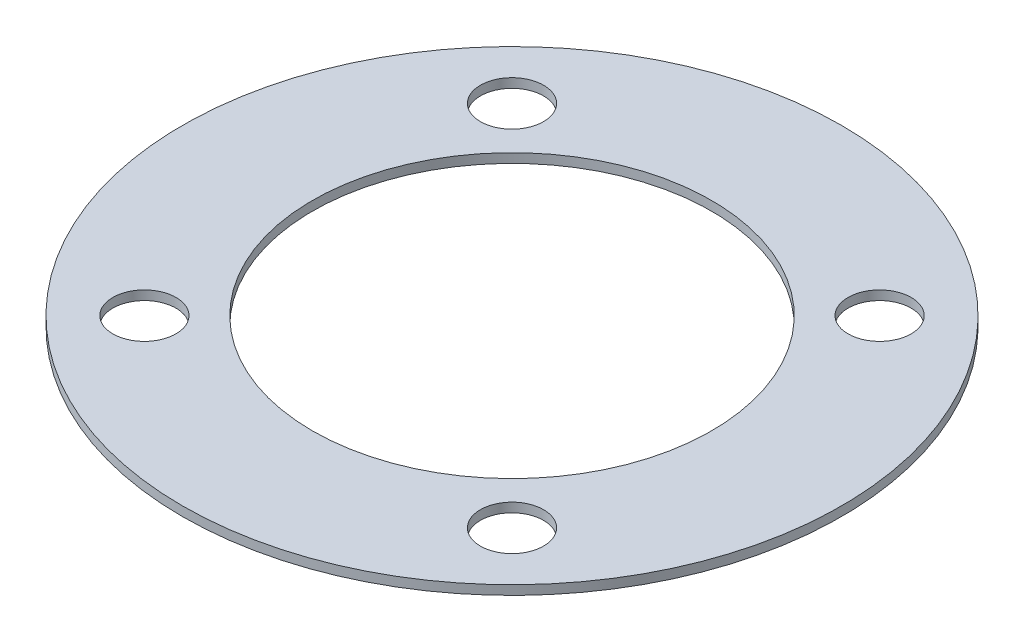
ISO-10303-21;
HEADER;
FILE_DESCRIPTION(('STEP AP214'),'2;1');
FILE_NAME('part.step','',(''),(''),'','','');
FILE_SCHEMA(('AUTOMOTIVE_DESIGN { 1 0 10303 214 1 1 1 1 }'));
ENDSEC;
DATA;
#1=APPLICATION_CONTEXT('core data for automotive mechanical design processes');
#2=APPLICATION_PROTOCOL_DEFINITION('international standard','automotive_design',2000,#1);
#3=PRODUCT_CONTEXT('',#1,'mechanical');
#4=PRODUCT('Part','Part','',(#3));
#5=PRODUCT_RELATED_PRODUCT_CATEGORY('part','',(#4));
#6=PRODUCT_DEFINITION_FORMATION('','',#4);
#7=PRODUCT_DEFINITION_CONTEXT('part definition',#1,'design');
#8=PRODUCT_DEFINITION('design','',#6,#7);
#9=PRODUCT_DEFINITION_SHAPE('','',#8);
#10=(LENGTH_UNIT() NAMED_UNIT(*) SI_UNIT(.MILLI.,.METRE.));
#11=(NAMED_UNIT(*) PLANE_ANGLE_UNIT() SI_UNIT($,.RADIAN.));
#12=(NAMED_UNIT(*) SI_UNIT($,.STERADIAN.) SOLID_ANGLE_UNIT());
#13=UNCERTAINTY_MEASURE_WITH_UNIT(LENGTH_MEASURE(1.E-05),#10,'distance_accuracy_value','');
#14=(GEOMETRIC_REPRESENTATION_CONTEXT(3) GLOBAL_UNCERTAINTY_ASSIGNED_CONTEXT((#13)) GLOBAL_UNIT_ASSIGNED_CONTEXT((#10,
#11,#12)) REPRESENTATION_CONTEXT('',''));
#15=CARTESIAN_POINT('',(0.,0.,0.));
#16=DIRECTION('',(0.,0.,1.));
#17=DIRECTION('',(1.,0.,0.));
#18=AXIS2_PLACEMENT_3D('',#15,#16,#17);
#19=CARTESIAN_POINT('',(0.,0.5,0.));
#20=DIRECTION('',(0.,-1.,0.));
#21=DIRECTION('',(0.,0.,-1.));
#22=AXIS2_PLACEMENT_3D('',#19,#20,#21);
#23=CYLINDRICAL_SURFACE('',#22,17.75);
#24=CARTESIAN_POINT('',(0.,0.5,0.));
#25=DIRECTION('',(0.,1.,0.));
#26=DIRECTION('',(0.,0.,1.));
#27=AXIS2_PLACEMENT_3D('',#24,#25,#26);
#28=CIRCLE('',#27,17.75);
#29=CARTESIAN_POINT('',(0.,0.5,17.75));
#30=VERTEX_POINT('',#29);
#31=EDGE_CURVE('E10',#30,#30,#28,.T.);
#32=ORIENTED_EDGE('',*,*,#31,.F.);
#33=EDGE_LOOP('',(#32));
#34=FACE_BOUND('',#33,.T.);
#35=CARTESIAN_POINT('',(0.,0.,0.));
#36=DIRECTION('',(0.,1.,0.));
#37=DIRECTION('',(0.,0.,1.));
#38=AXIS2_PLACEMENT_3D('',#35,#36,#37);
#39=CIRCLE('',#38,17.75);
#40=CARTESIAN_POINT('',(0.,0.,17.75));
#41=VERTEX_POINT('',#40);
#42=EDGE_CURVE('E41',#41,#41,#39,.T.);
#43=ORIENTED_EDGE('',*,*,#42,.T.);
#44=EDGE_LOOP('',(#43));
#45=FACE_BOUND('',#44,.T.);
#46=ADVANCED_FACE('F38',(#34,#45),#23,.T.);
#47=CARTESIAN_POINT('',(0.,0.5,0.));
#48=DIRECTION('',(0.,1.,0.));
#49=DIRECTION('',(0.,0.,1.));
#50=AXIS2_PLACEMENT_3D('',#47,#48,#49);
#51=PLANE('',#50);
#52=CARTESIAN_POINT('',(-9.89949493661167,0.5,-9.89949493661167));
#53=DIRECTION('',(0.,1.,0.));
#54=DIRECTION('',(0.,0.,1.));
#55=AXIS2_PLACEMENT_3D('',#52,#53,#54);
#56=CIRCLE('',#55,1.7);
#57=CARTESIAN_POINT('',(-9.89949493661167,0.5,-8.19949493661167));
#58=VERTEX_POINT('',#57);
#59=EDGE_CURVE('E76',#58,#58,#56,.T.);
#60=ORIENTED_EDGE('',*,*,#59,.F.);
#61=EDGE_LOOP('',(#60));
#62=FACE_BOUND('',#61,.T.);
#63=CARTESIAN_POINT('',(9.89949493661167,0.5,9.89949493661167));
#64=DIRECTION('',(0.,1.,0.));
#65=DIRECTION('',(0.,0.,1.));
#66=AXIS2_PLACEMENT_3D('',#63,#64,#65);
#67=CIRCLE('',#66,1.7);
#68=CARTESIAN_POINT('',(9.89949493661167,0.5,11.5994949366117));
#69=VERTEX_POINT('',#68);
#70=EDGE_CURVE('E70',#69,#69,#67,.T.);
#71=ORIENTED_EDGE('',*,*,#70,.F.);
#72=EDGE_LOOP('',(#71));
#73=FACE_BOUND('',#72,.T.);
#74=CARTESIAN_POINT('',(-9.89949493661167,0.5,9.89949493661167));
#75=DIRECTION('',(0.,1.,0.));
#76=DIRECTION('',(0.,0.,1.));
#77=AXIS2_PLACEMENT_3D('',#74,#75,#76);
#78=CIRCLE('',#77,1.7);
#79=CARTESIAN_POINT('',(-9.89949493661167,0.5,11.5994949366117));
#80=VERTEX_POINT('',#79);
#81=EDGE_CURVE('E64',#80,#80,#78,.T.);
#82=ORIENTED_EDGE('',*,*,#81,.F.);
#83=EDGE_LOOP('',(#82));
#84=FACE_BOUND('',#83,.T.);
#85=CARTESIAN_POINT('',(9.89949493661167,0.5,-9.89949493661167));
#86=DIRECTION('',(0.,1.,0.));
#87=DIRECTION('',(0.,0.,1.));
#88=AXIS2_PLACEMENT_3D('',#85,#86,#87);
#89=CIRCLE('',#88,1.7);
#90=CARTESIAN_POINT('',(9.89949493661167,0.5,-8.19949493661167));
#91=VERTEX_POINT('',#90);
#92=EDGE_CURVE('E58',#91,#91,#89,.T.);
#93=ORIENTED_EDGE('',*,*,#92,.F.);
#94=EDGE_LOOP('',(#93));
#95=FACE_BOUND('',#94,.T.);
#96=CARTESIAN_POINT('',(0.,0.5,0.));
#97=DIRECTION('',(0.,1.,0.));
#98=DIRECTION('',(0.,0.,1.));
#99=AXIS2_PLACEMENT_3D('',#96,#97,#98);
#100=CIRCLE('',#99,10.75);
#101=CARTESIAN_POINT('',(0.,0.5,10.75));
#102=VERTEX_POINT('',#101);
#103=EDGE_CURVE('E50',#102,#102,#100,.T.);
#104=ORIENTED_EDGE('',*,*,#103,.F.);
#105=EDGE_LOOP('',(#104));
#106=FACE_BOUND('',#105,.T.);
#107=ORIENTED_EDGE('',*,*,#31,.T.);
#108=EDGE_LOOP('',(#107));
#109=FACE_BOUND('',#108,.T.);
#110=ADVANCED_FACE('F82',(#62,#73,#84,#95,#106,#109),#51,.T.);
#111=CARTESIAN_POINT('',(0.,0.,0.));
#112=DIRECTION('',(0.,1.,0.));
#113=DIRECTION('',(0.,0.,1.));
#114=AXIS2_PLACEMENT_3D('',#111,#112,#113);
#115=PLANE('',#114);
#116=CARTESIAN_POINT('',(-9.89949493661167,0.,-9.89949493661167));
#117=DIRECTION('',(0.,1.,0.));
#118=DIRECTION('',(0.,0.,1.));
#119=AXIS2_PLACEMENT_3D('',#116,#117,#118);
#120=CIRCLE('',#119,1.7);
#121=CARTESIAN_POINT('',(-9.89949493661167,0.,-8.19949493661166));
#122=VERTEX_POINT('',#121);
#123=EDGE_CURVE('E73',#122,#122,#120,.T.);
#124=ORIENTED_EDGE('',*,*,#123,.T.);
#125=EDGE_LOOP('',(#124));
#126=FACE_BOUND('',#125,.T.);
#127=CARTESIAN_POINT('',(9.89949493661167,0.,9.89949493661167));
#128=DIRECTION('',(0.,1.,0.));
#129=DIRECTION('',(0.,0.,1.));
#130=AXIS2_PLACEMENT_3D('',#127,#128,#129);
#131=CIRCLE('',#130,1.7);
#132=CARTESIAN_POINT('',(9.89949493661167,0.,11.5994949366117));
#133=VERTEX_POINT('',#132);
#134=EDGE_CURVE('E67',#133,#133,#131,.T.);
#135=ORIENTED_EDGE('',*,*,#134,.T.);
#136=EDGE_LOOP('',(#135));
#137=FACE_BOUND('',#136,.T.);
#138=CARTESIAN_POINT('',(-9.89949493661167,0.,9.89949493661167));
#139=DIRECTION('',(0.,1.,0.));
#140=DIRECTION('',(0.,0.,1.));
#141=AXIS2_PLACEMENT_3D('',#138,#139,#140);
#142=CIRCLE('',#141,1.7);
#143=CARTESIAN_POINT('',(-9.89949493661167,0.,11.5994949366117));
#144=VERTEX_POINT('',#143);
#145=EDGE_CURVE('E61',#144,#144,#142,.T.);
#146=ORIENTED_EDGE('',*,*,#145,.T.);
#147=EDGE_LOOP('',(#146));
#148=FACE_BOUND('',#147,.T.);
#149=CARTESIAN_POINT('',(9.89949493661167,0.,-9.89949493661167));
#150=DIRECTION('',(0.,1.,0.));
#151=DIRECTION('',(0.,0.,1.));
#152=AXIS2_PLACEMENT_3D('',#149,#150,#151);
#153=CIRCLE('',#152,1.7);
#154=CARTESIAN_POINT('',(9.89949493661167,0.,-8.19949493661166));
#155=VERTEX_POINT('',#154);
#156=EDGE_CURVE('E53',#155,#155,#153,.T.);
#157=ORIENTED_EDGE('',*,*,#156,.T.);
#158=EDGE_LOOP('',(#157));
#159=FACE_BOUND('',#158,.T.);
#160=CARTESIAN_POINT('',(0.,0.,0.));
#161=DIRECTION('',(0.,1.,0.));
#162=DIRECTION('',(0.,0.,1.));
#163=AXIS2_PLACEMENT_3D('',#160,#161,#162);
#164=CIRCLE('',#163,10.75);
#165=CARTESIAN_POINT('',(0.,0.,10.75));
#166=VERTEX_POINT('',#165);
#167=EDGE_CURVE('E48',#166,#166,#164,.T.);
#168=ORIENTED_EDGE('',*,*,#167,.T.);
#169=EDGE_LOOP('',(#168));
#170=FACE_BOUND('',#169,.T.);
#171=ORIENTED_EDGE('',*,*,#42,.F.);
#172=EDGE_LOOP('',(#171));
#173=FACE_BOUND('',#172,.T.);
#174=ADVANCED_FACE('F85',(#126,#137,#148,#159,#170,#173),#115,.F.);
#175=CARTESIAN_POINT('',(0.,0.,0.));
#176=DIRECTION('',(0.,1.,0.));
#177=DIRECTION('',(0.,0.,1.));
#178=AXIS2_PLACEMENT_3D('',#175,#176,#177);
#179=CYLINDRICAL_SURFACE('',#178,10.75);
#180=ORIENTED_EDGE('',*,*,#167,.F.);
#181=EDGE_LOOP('',(#180));
#182=FACE_BOUND('',#181,.T.);
#183=ORIENTED_EDGE('',*,*,#103,.T.);
#184=EDGE_LOOP('',(#183));
#185=FACE_BOUND('',#184,.T.);
#186=ADVANCED_FACE('F95',(#182,#185),#179,.F.);
#187=CARTESIAN_POINT('',(9.89949493661167,0.5,-9.89949493661167));
#188=DIRECTION('',(0.,1.,0.));
#189=DIRECTION('',(0.,0.,1.));
#190=AXIS2_PLACEMENT_3D('',#187,#188,#189);
#191=CYLINDRICAL_SURFACE('',#190,1.7);
#192=ORIENTED_EDGE('',*,*,#156,.F.);
#193=EDGE_LOOP('',(#192));
#194=FACE_BOUND('',#193,.T.);
#195=ORIENTED_EDGE('',*,*,#92,.T.);
#196=EDGE_LOOP('',(#195));
#197=FACE_BOUND('',#196,.T.);
#198=ADVANCED_FACE('F97',(#194,#197),#191,.F.);
#199=CARTESIAN_POINT('',(-9.89949493661167,0.5,9.89949493661167));
#200=DIRECTION('',(0.,1.,0.));
#201=DIRECTION('',(0.,0.,1.));
#202=AXIS2_PLACEMENT_3D('',#199,#200,#201);
#203=CYLINDRICAL_SURFACE('',#202,1.7);
#204=ORIENTED_EDGE('',*,*,#145,.F.);
#205=EDGE_LOOP('',(#204));
#206=FACE_BOUND('',#205,.T.);
#207=ORIENTED_EDGE('',*,*,#81,.T.);
#208=EDGE_LOOP('',(#207));
#209=FACE_BOUND('',#208,.T.);
#210=ADVANCED_FACE('F104',(#206,#209),#203,.F.);
#211=CARTESIAN_POINT('',(9.89949493661167,0.5,9.89949493661167));
#212=DIRECTION('',(0.,1.,0.));
#213=DIRECTION('',(0.,0.,1.));
#214=AXIS2_PLACEMENT_3D('',#211,#212,#213);
#215=CYLINDRICAL_SURFACE('',#214,1.7);
#216=ORIENTED_EDGE('',*,*,#134,.F.);
#217=EDGE_LOOP('',(#216));
#218=FACE_BOUND('',#217,.T.);
#219=ORIENTED_EDGE('',*,*,#70,.T.);
#220=EDGE_LOOP('',(#219));
#221=FACE_BOUND('',#220,.T.);
#222=ADVANCED_FACE('F148',(#218,#221),#215,.F.);
#223=CARTESIAN_POINT('',(-9.89949493661167,0.5,-9.89949493661167));
#224=DIRECTION('',(0.,1.,0.));
#225=DIRECTION('',(0.,0.,1.));
#226=AXIS2_PLACEMENT_3D('',#223,#224,#225);
#227=CYLINDRICAL_SURFACE('',#226,1.7);
#228=ORIENTED_EDGE('',*,*,#123,.F.);
#229=EDGE_LOOP('',(#228));
#230=FACE_BOUND('',#229,.T.);
#231=ORIENTED_EDGE('',*,*,#59,.T.);
#232=EDGE_LOOP('',(#231));
#233=FACE_BOUND('',#232,.T.);
#234=ADVANCED_FACE('F80',(#230,#233),#227,.F.);
#235=CLOSED_SHELL('',(#46,#110,#174,#186,#198,#210,#222,#234));
#236=MANIFOLD_SOLID_BREP('B2',#235);
#237=ADVANCED_BREP_SHAPE_REPRESENTATION('',(#18,#236),#14);
#238=SHAPE_DEFINITION_REPRESENTATION(#9,#237);
ENDSEC;
END-ISO-10303-21;
